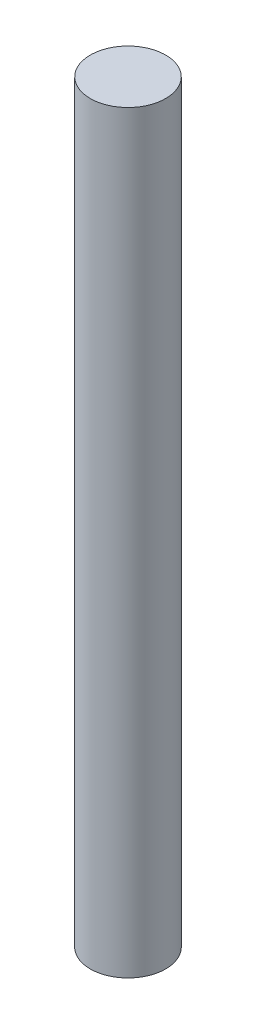
ISO-10303-21;
HEADER;
FILE_DESCRIPTION(('STEP AP214'),'2;1');
FILE_NAME('part.step','',(''),(''),'','','');
FILE_SCHEMA(('AUTOMOTIVE_DESIGN { 1 0 10303 214 1 1 1 1 }'));
ENDSEC;
DATA;
#1=APPLICATION_CONTEXT('core data for automotive mechanical design processes');
#2=APPLICATION_PROTOCOL_DEFINITION('international standard','automotive_design',2000,#1);
#3=PRODUCT_CONTEXT('',#1,'mechanical');
#4=PRODUCT('Part','Part','',(#3));
#5=PRODUCT_RELATED_PRODUCT_CATEGORY('part','',(#4));
#6=PRODUCT_DEFINITION_FORMATION('','',#4);
#7=PRODUCT_DEFINITION_CONTEXT('part definition',#1,'design');
#8=PRODUCT_DEFINITION('design','',#6,#7);
#9=PRODUCT_DEFINITION_SHAPE('','',#8);
#10=(LENGTH_UNIT() NAMED_UNIT(*) SI_UNIT(.MILLI.,.METRE.));
#11=(NAMED_UNIT(*) PLANE_ANGLE_UNIT() SI_UNIT($,.RADIAN.));
#12=(NAMED_UNIT(*) SI_UNIT($,.STERADIAN.) SOLID_ANGLE_UNIT());
#13=UNCERTAINTY_MEASURE_WITH_UNIT(LENGTH_MEASURE(1.E-05),#10,'distance_accuracy_value','');
#14=(GEOMETRIC_REPRESENTATION_CONTEXT(3) GLOBAL_UNCERTAINTY_ASSIGNED_CONTEXT((#13)) GLOBAL_UNIT_ASSIGNED_CONTEXT((#10,
#11,#12)) REPRESENTATION_CONTEXT('',''));
#15=CARTESIAN_POINT('',(0.,0.,0.));
#16=DIRECTION('',(0.,0.,1.));
#17=DIRECTION('',(1.,0.,0.));
#18=AXIS2_PLACEMENT_3D('',#15,#16,#17);
#19=CARTESIAN_POINT('',(0.,30.,0.));
#20=DIRECTION('',(0.,-1.,0.));
#21=DIRECTION('',(0.,0.,-1.));
#22=AXIS2_PLACEMENT_3D('',#19,#20,#21);
#23=CYLINDRICAL_SURFACE('',#22,1.5);
#24=CARTESIAN_POINT('',(0.,30.,0.));
#25=DIRECTION('',(0.,1.,0.));
#26=DIRECTION('',(0.,0.,1.));
#27=AXIS2_PLACEMENT_3D('',#24,#25,#26);
#28=CIRCLE('',#27,1.5);
#29=CARTESIAN_POINT('',(0.,30.,1.5));
#30=VERTEX_POINT('',#29);
#31=EDGE_CURVE('E10',#30,#30,#28,.T.);
#32=ORIENTED_EDGE('',*,*,#31,.F.);
#33=EDGE_LOOP('',(#32));
#34=FACE_BOUND('',#33,.T.);
#35=CARTESIAN_POINT('',(0.,0.,0.));
#36=DIRECTION('',(0.,1.,0.));
#37=DIRECTION('',(0.,0.,1.));
#38=AXIS2_PLACEMENT_3D('',#35,#36,#37);
#39=CIRCLE('',#38,1.5);
#40=CARTESIAN_POINT('',(0.,0.,1.5));
#41=VERTEX_POINT('',#40);
#42=EDGE_CURVE('E34',#41,#41,#39,.T.);
#43=ORIENTED_EDGE('',*,*,#42,.T.);
#44=EDGE_LOOP('',(#43));
#45=FACE_BOUND('',#44,.T.);
#46=ADVANCED_FACE('F31',(#34,#45),#23,.T.);
#47=CARTESIAN_POINT('',(0.,30.,0.));
#48=DIRECTION('',(0.,1.,0.));
#49=DIRECTION('',(0.,0.,1.));
#50=AXIS2_PLACEMENT_3D('',#47,#48,#49);
#51=PLANE('',#50);
#52=ORIENTED_EDGE('',*,*,#31,.T.);
#53=EDGE_LOOP('',(#52));
#54=FACE_BOUND('',#53,.T.);
#55=ADVANCED_FACE('F46',(#54),#51,.T.);
#56=CARTESIAN_POINT('',(0.,0.,0.));
#57=DIRECTION('',(0.,1.,0.));
#58=DIRECTION('',(0.,0.,1.));
#59=AXIS2_PLACEMENT_3D('',#56,#57,#58);
#60=PLANE('',#59);
#61=ORIENTED_EDGE('',*,*,#42,.F.);
#62=EDGE_LOOP('',(#61));
#63=FACE_BOUND('',#62,.T.);
#64=ADVANCED_FACE('F44',(#63),#60,.F.);
#65=CLOSED_SHELL('',(#46,#55,#64));
#66=MANIFOLD_SOLID_BREP('B2',#65);
#67=ADVANCED_BREP_SHAPE_REPRESENTATION('',(#18,#66),#14);
#68=SHAPE_DEFINITION_REPRESENTATION(#9,#67);
ENDSEC;
END-ISO-10303-21;
